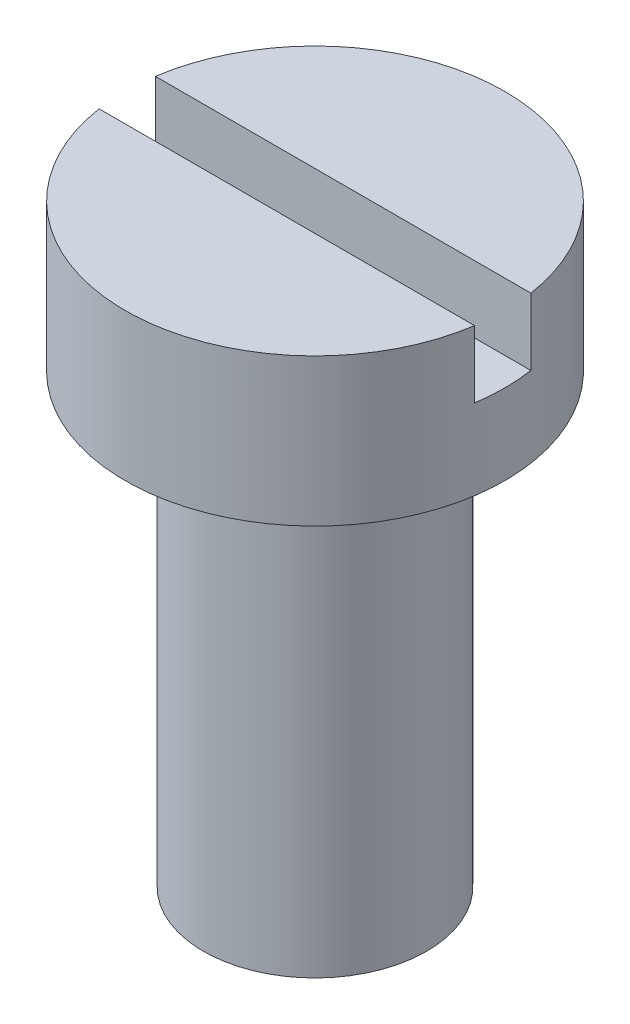
ISO-10303-21;
HEADER;
FILE_DESCRIPTION(('STEP AP214'),'2;1');
FILE_NAME('part.step','',(''),(''),'','','');
FILE_SCHEMA(('AUTOMOTIVE_DESIGN { 1 0 10303 214 1 1 1 1 }'));
ENDSEC;
DATA;
#1=APPLICATION_CONTEXT('core data for automotive mechanical design processes');
#2=APPLICATION_PROTOCOL_DEFINITION('international standard','automotive_design',2000,#1);
#3=PRODUCT_CONTEXT('',#1,'mechanical');
#4=PRODUCT('Part','Part','',(#3));
#5=PRODUCT_RELATED_PRODUCT_CATEGORY('part','',(#4));
#6=PRODUCT_DEFINITION_FORMATION('','',#4);
#7=PRODUCT_DEFINITION_CONTEXT('part definition',#1,'design');
#8=PRODUCT_DEFINITION('design','',#6,#7);
#9=PRODUCT_DEFINITION_SHAPE('','',#8);
#10=(LENGTH_UNIT() NAMED_UNIT(*) SI_UNIT(.MILLI.,.METRE.));
#11=(NAMED_UNIT(*) PLANE_ANGLE_UNIT() SI_UNIT($,.RADIAN.));
#12=(NAMED_UNIT(*) SI_UNIT($,.STERADIAN.) SOLID_ANGLE_UNIT());
#13=UNCERTAINTY_MEASURE_WITH_UNIT(LENGTH_MEASURE(1.E-05),#10,'distance_accuracy_value','');
#14=(GEOMETRIC_REPRESENTATION_CONTEXT(3) GLOBAL_UNCERTAINTY_ASSIGNED_CONTEXT((#13)) GLOBAL_UNIT_ASSIGNED_CONTEXT((#10,
#11,#12)) REPRESENTATION_CONTEXT('',''));
#15=CARTESIAN_POINT('',(0.,0.,0.));
#16=DIRECTION('',(0.,0.,1.));
#17=DIRECTION('',(1.,0.,0.));
#18=AXIS2_PLACEMENT_3D('',#15,#16,#17);
#19=CARTESIAN_POINT('',(4.25,13.3,0.));
#20=DIRECTION('',(0.,1.,0.));
#21=DIRECTION('',(0.,0.,1.));
#22=AXIS2_PLACEMENT_3D('',#19,#20,#21);
#23=PLANE('',#22);
#24=DIRECTION('',(1.,0.,0.));
#25=VECTOR('',#24,1.);
#26=CARTESIAN_POINT('',(4.2030465141371,13.3,0.630000000000001));
#27=LINE('',#26,#25);
#28=CARTESIAN_POINT('',(-4.2030465141371,13.3,0.630000000000002));
#29=VERTEX_POINT('',#28);
#30=CARTESIAN_POINT('',(4.2030465141371,13.3,0.630000000000001));
#31=VERTEX_POINT('',#30);
#32=EDGE_CURVE('E68',#29,#31,#27,.T.);
#33=ORIENTED_EDGE('',*,*,#32,.F.);
#34=CARTESIAN_POINT('',(0.,13.3,0.));
#35=DIRECTION('',(0.,-1.,0.));
#36=DIRECTION('',(0.,0.,-1.));
#37=AXIS2_PLACEMENT_3D('',#34,#35,#36);
#38=CIRCLE('',#37,4.25);
#39=EDGE_CURVE('E106',#31,#29,#38,.T.);
#40=ORIENTED_EDGE('',*,*,#39,.F.);
#41=EDGE_LOOP('',(#33,#40));
#42=FACE_BOUND('',#41,.T.);
#43=ADVANCED_FACE('F30',(#42),#23,.T.);
#44=CARTESIAN_POINT('',(0.,0.,0.));
#45=DIRECTION('',(0.,-1.,0.));
#46=DIRECTION('',(0.,0.,-1.));
#47=AXIS2_PLACEMENT_3D('',#44,#45,#46);
#48=PLANE('',#47);
#49=CARTESIAN_POINT('',(0.,0.,0.));
#50=DIRECTION('',(0.,-1.,0.));
#51=DIRECTION('',(0.,0.,-1.));
#52=AXIS2_PLACEMENT_3D('',#49,#50,#51);
#53=CIRCLE('',#52,2.5);
#54=CARTESIAN_POINT('',(0.,0.,-2.5));
#55=VERTEX_POINT('',#54);
#56=EDGE_CURVE('E11',#55,#55,#53,.T.);
#57=ORIENTED_EDGE('',*,*,#56,.T.);
#58=EDGE_LOOP('',(#57));
#59=FACE_BOUND('',#58,.T.);
#60=ADVANCED_FACE('F32',(#59),#48,.T.);
#61=CARTESIAN_POINT('',(0.,0.,0.));
#62=DIRECTION('',(0.,-1.,0.));
#63=DIRECTION('',(0.,0.,-1.));
#64=AXIS2_PLACEMENT_3D('',#61,#62,#63);
#65=CYLINDRICAL_SURFACE('',#64,2.5);
#66=CARTESIAN_POINT('',(0.,10.,0.));
#67=DIRECTION('',(0.,-1.,0.));
#68=DIRECTION('',(0.,0.,-1.));
#69=AXIS2_PLACEMENT_3D('',#66,#67,#68);
#70=CIRCLE('',#69,2.5);
#71=CARTESIAN_POINT('',(0.,10.,-2.5));
#72=VERTEX_POINT('',#71);
#73=EDGE_CURVE('E38',#72,#72,#70,.T.);
#74=ORIENTED_EDGE('',*,*,#73,.T.);
#75=EDGE_LOOP('',(#74));
#76=FACE_BOUND('',#75,.T.);
#77=ORIENTED_EDGE('',*,*,#56,.F.);
#78=EDGE_LOOP('',(#77));
#79=FACE_BOUND('',#78,.T.);
#80=ADVANCED_FACE('F112',(#76,#79),#65,.T.);
#81=CARTESIAN_POINT('',(2.5,10.,0.));
#82=DIRECTION('',(0.,-1.,0.));
#83=DIRECTION('',(0.,0.,-1.));
#84=AXIS2_PLACEMENT_3D('',#81,#82,#83);
#85=PLANE('',#84);
#86=CARTESIAN_POINT('',(0.,10.,0.));
#87=DIRECTION('',(0.,-1.,0.));
#88=DIRECTION('',(0.,0.,-1.));
#89=AXIS2_PLACEMENT_3D('',#86,#87,#88);
#90=CIRCLE('',#89,4.25);
#91=CARTESIAN_POINT('',(0.,10.,-4.25));
#92=VERTEX_POINT('',#91);
#93=EDGE_CURVE('E107',#92,#92,#90,.T.);
#94=ORIENTED_EDGE('',*,*,#93,.T.);
#95=EDGE_LOOP('',(#94));
#96=FACE_BOUND('',#95,.T.);
#97=ORIENTED_EDGE('',*,*,#73,.F.);
#98=EDGE_LOOP('',(#97));
#99=FACE_BOUND('',#98,.T.);
#100=ADVANCED_FACE('F115',(#96,#99),#85,.T.);
#101=CARTESIAN_POINT('',(0.,0.,0.));
#102=DIRECTION('',(0.,-1.,0.));
#103=DIRECTION('',(0.,0.,-1.));
#104=AXIS2_PLACEMENT_3D('',#101,#102,#103);
#105=CYLINDRICAL_SURFACE('',#104,4.25);
#106=DIRECTION('',(0.,1.,0.));
#107=VECTOR('',#106,1.);
#108=CARTESIAN_POINT('',(-4.2030465141371,11.8,0.630000000000002));
#109=LINE('',#108,#107);
#110=CARTESIAN_POINT('',(-4.2030465141371,11.8,0.630000000000002));
#111=VERTEX_POINT('',#110);
#112=EDGE_CURVE('E82',#111,#29,#109,.T.);
#113=ORIENTED_EDGE('',*,*,#112,.F.);
#114=CARTESIAN_POINT('',(0.,11.8,0.));
#115=DIRECTION('',(0.,1.,0.));
#116=DIRECTION('',(0.,0.,1.));
#117=AXIS2_PLACEMENT_3D('',#114,#115,#116);
#118=CIRCLE('',#117,4.25);
#119=CARTESIAN_POINT('',(-4.2030465141371,11.8,-0.63));
#120=VERTEX_POINT('',#119);
#121=EDGE_CURVE('E86',#120,#111,#118,.T.);
#122=ORIENTED_EDGE('',*,*,#121,.F.);
#123=DIRECTION('',(0.,1.,0.));
#124=VECTOR('',#123,1.);
#125=CARTESIAN_POINT('',(-4.2030465141371,11.8,-0.63));
#126=LINE('',#125,#124);
#127=CARTESIAN_POINT('',(-4.2030465141371,13.3,-0.63));
#128=VERTEX_POINT('',#127);
#129=EDGE_CURVE('E75',#120,#128,#126,.T.);
#130=ORIENTED_EDGE('',*,*,#129,.T.);
#131=CARTESIAN_POINT('',(4.2030465141371,13.3,-0.63));
#132=VERTEX_POINT('',#131);
#133=EDGE_CURVE('E102',#128,#132,#38,.T.);
#134=ORIENTED_EDGE('',*,*,#133,.T.);
#135=DIRECTION('',(0.,1.,0.));
#136=VECTOR('',#135,1.);
#137=CARTESIAN_POINT('',(4.2030465141371,11.8,-0.63));
#138=LINE('',#137,#136);
#139=CARTESIAN_POINT('',(4.2030465141371,11.8,-0.63));
#140=VERTEX_POINT('',#139);
#141=EDGE_CURVE('E45',#140,#132,#138,.T.);
#142=ORIENTED_EDGE('',*,*,#141,.F.);
#143=CARTESIAN_POINT('',(0.,11.8,0.));
#144=DIRECTION('',(0.,1.,0.));
#145=DIRECTION('',(0.,0.,1.));
#146=AXIS2_PLACEMENT_3D('',#143,#144,#145);
#147=CIRCLE('',#146,4.25);
#148=CARTESIAN_POINT('',(4.2030465141371,11.8,0.630000000000001));
#149=VERTEX_POINT('',#148);
#150=EDGE_CURVE('E88',#149,#140,#147,.T.);
#151=ORIENTED_EDGE('',*,*,#150,.F.);
#152=DIRECTION('',(0.,1.,0.));
#153=VECTOR('',#152,1.);
#154=CARTESIAN_POINT('',(4.2030465141371,11.8,0.630000000000001));
#155=LINE('',#154,#153);
#156=EDGE_CURVE('E54',#149,#31,#155,.T.);
#157=ORIENTED_EDGE('',*,*,#156,.T.);
#158=ORIENTED_EDGE('',*,*,#39,.T.);
#159=EDGE_LOOP('',(#113,#122,#130,#134,#142,#151,#157,#158));
#160=FACE_BOUND('',#159,.T.);
#161=ORIENTED_EDGE('',*,*,#93,.F.);
#162=EDGE_LOOP('',(#161));
#163=FACE_BOUND('',#162,.T.);
#164=ADVANCED_FACE('F91',(#160,#163),#105,.T.);
#165=DIRECTION('',(-1.,0.,0.));
#166=VECTOR('',#165,1.);
#167=CARTESIAN_POINT('',(4.2030465141371,13.3,-0.63));
#168=LINE('',#167,#166);
#169=EDGE_CURVE('E77',#132,#128,#168,.T.);
#170=ORIENTED_EDGE('',*,*,#169,.F.);
#171=ORIENTED_EDGE('',*,*,#133,.F.);
#172=EDGE_LOOP('',(#170,#171));
#173=FACE_BOUND('',#172,.T.);
#174=ADVANCED_FACE('F123',(#173),#23,.T.);
#175=CARTESIAN_POINT('',(4.2030465141371,11.8,0.630000000000001));
#176=DIRECTION('',(0.,0.,1.));
#177=DIRECTION('',(1.,0.,0.));
#178=AXIS2_PLACEMENT_3D('',#175,#176,#177);
#179=PLANE('',#178);
#180=ORIENTED_EDGE('',*,*,#32,.T.);
#181=ORIENTED_EDGE('',*,*,#156,.F.);
#182=DIRECTION('',(1.,0.,0.));
#183=VECTOR('',#182,1.);
#184=CARTESIAN_POINT('',(4.2030465141371,11.8,0.630000000000001));
#185=LINE('',#184,#183);
#186=EDGE_CURVE('E94',#111,#149,#185,.T.);
#187=ORIENTED_EDGE('',*,*,#186,.F.);
#188=ORIENTED_EDGE('',*,*,#112,.T.);
#189=EDGE_LOOP('',(#180,#181,#187,#188));
#190=FACE_BOUND('',#189,.T.);
#191=ADVANCED_FACE('F134',(#190),#179,.F.);
#192=CARTESIAN_POINT('',(4.2030465141371,11.8,-0.63));
#193=DIRECTION('',(0.,0.,-1.));
#194=DIRECTION('',(-1.,0.,0.));
#195=AXIS2_PLACEMENT_3D('',#192,#193,#194);
#196=PLANE('',#195);
#197=ORIENTED_EDGE('',*,*,#169,.T.);
#198=ORIENTED_EDGE('',*,*,#129,.F.);
#199=DIRECTION('',(-1.,0.,0.));
#200=VECTOR('',#199,1.);
#201=CARTESIAN_POINT('',(4.2030465141371,11.8,-0.63));
#202=LINE('',#201,#200);
#203=EDGE_CURVE('E72',#140,#120,#202,.T.);
#204=ORIENTED_EDGE('',*,*,#203,.F.);
#205=ORIENTED_EDGE('',*,*,#141,.T.);
#206=EDGE_LOOP('',(#197,#198,#204,#205));
#207=FACE_BOUND('',#206,.T.);
#208=ADVANCED_FACE('F76',(#207),#196,.F.);
#209=CARTESIAN_POINT('',(0.,11.8,0.));
#210=DIRECTION('',(0.,1.,0.));
#211=DIRECTION('',(0.,0.,1.));
#212=AXIS2_PLACEMENT_3D('',#209,#210,#211);
#213=PLANE('',#212);
#214=ORIENTED_EDGE('',*,*,#150,.T.);
#215=ORIENTED_EDGE('',*,*,#203,.T.);
#216=ORIENTED_EDGE('',*,*,#121,.T.);
#217=ORIENTED_EDGE('',*,*,#186,.T.);
#218=EDGE_LOOP('',(#214,#215,#216,#217));
#219=FACE_BOUND('',#218,.T.);
#220=ADVANCED_FACE('F85',(#219),#213,.T.);
#221=CLOSED_SHELL('',(#43,#60,#80,#100,#164,#174,#191,#208,#220));
#222=MANIFOLD_SOLID_BREP('B2',#221);
#223=ADVANCED_BREP_SHAPE_REPRESENTATION('',(#18,#222),#14);
#224=SHAPE_DEFINITION_REPRESENTATION(#9,#223);
ENDSEC;
END-ISO-10303-21;
